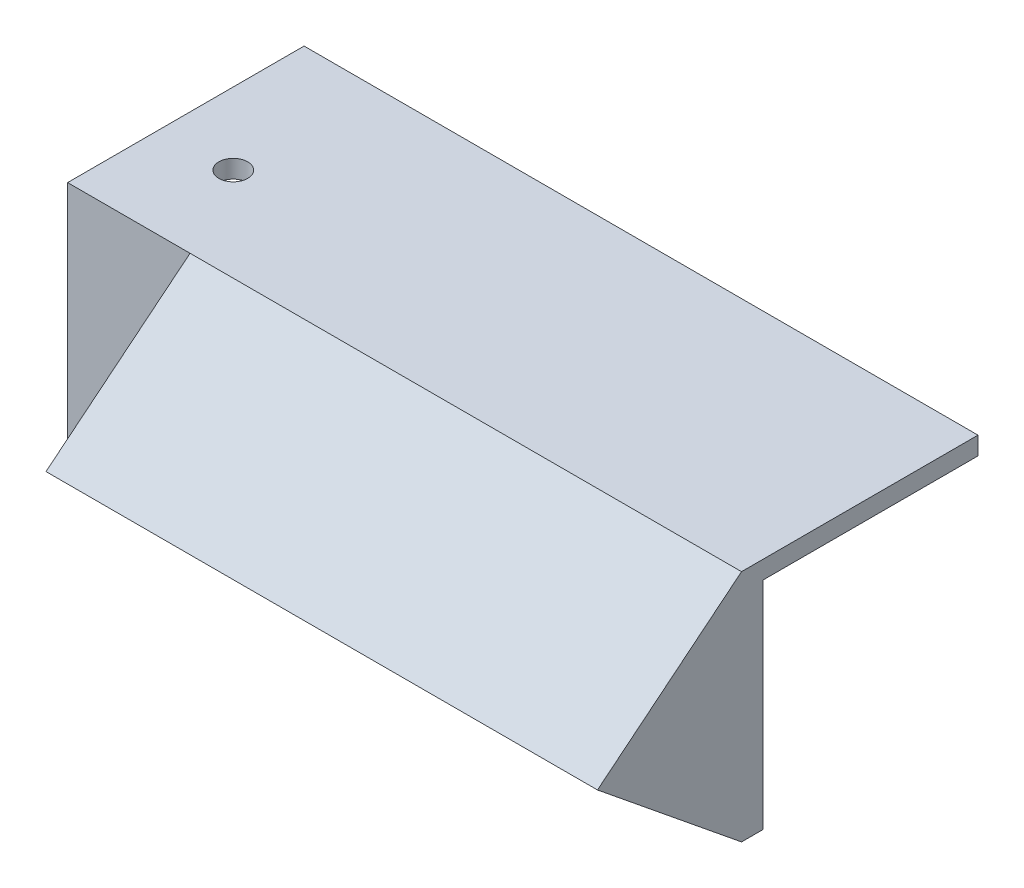
ISO-10303-21;
HEADER;
FILE_DESCRIPTION(('STEP AP214'),'2;1');
FILE_NAME('part.step','',(''),(''),'','','');
FILE_SCHEMA(('AUTOMOTIVE_DESIGN { 1 0 10303 214 1 1 1 1 }'));
ENDSEC;
DATA;
#1=APPLICATION_CONTEXT('core data for automotive mechanical design processes');
#2=APPLICATION_PROTOCOL_DEFINITION('international standard','automotive_design',2000,#1);
#3=PRODUCT_CONTEXT('',#1,'mechanical');
#4=PRODUCT('Part','Part','',(#3));
#5=PRODUCT_RELATED_PRODUCT_CATEGORY('part','',(#4));
#6=PRODUCT_DEFINITION_FORMATION('','',#4);
#7=PRODUCT_DEFINITION_CONTEXT('part definition',#1,'design');
#8=PRODUCT_DEFINITION('design','',#6,#7);
#9=PRODUCT_DEFINITION_SHAPE('','',#8);
#10=(LENGTH_UNIT() NAMED_UNIT(*) SI_UNIT(.MILLI.,.METRE.));
#11=(NAMED_UNIT(*) PLANE_ANGLE_UNIT() SI_UNIT($,.RADIAN.));
#12=(NAMED_UNIT(*) SI_UNIT($,.STERADIAN.) SOLID_ANGLE_UNIT());
#13=UNCERTAINTY_MEASURE_WITH_UNIT(LENGTH_MEASURE(1.E-05),#10,'distance_accuracy_value','');
#14=(GEOMETRIC_REPRESENTATION_CONTEXT(3) GLOBAL_UNCERTAINTY_ASSIGNED_CONTEXT((#13)) GLOBAL_UNIT_ASSIGNED_CONTEXT((#10,
#11,#12)) REPRESENTATION_CONTEXT('',''));
#15=CARTESIAN_POINT('',(0.,0.,0.));
#16=DIRECTION('',(0.,0.,1.));
#17=DIRECTION('',(1.,0.,0.));
#18=AXIS2_PLACEMENT_3D('',#15,#16,#17);
#19=CARTESIAN_POINT('',(0.,0.,91.));
#20=DIRECTION('',(0.,0.,1.));
#21=DIRECTION('',(1.,0.,0.));
#22=AXIS2_PLACEMENT_3D('',#19,#20,#21);
#23=PLANE('',#22);
#24=DIRECTION('',(0.,1.,0.));
#25=VECTOR('',#24,1.);
#26=CARTESIAN_POINT('',(19.,0.,91.));
#27=LINE('',#26,#25);
#28=CARTESIAN_POINT('',(19.,-45.8001,91.));
#29=VERTEX_POINT('',#28);
#30=CARTESIAN_POINT('',(19.,-43.3,91.));
#31=VERTEX_POINT('',#30);
#32=EDGE_CURVE('E155',#29,#31,#27,.T.);
#33=ORIENTED_EDGE('',*,*,#32,.F.);
#34=DIRECTION('',(-1.,0.,0.));
#35=VECTOR('',#34,1.);
#36=CARTESIAN_POINT('',(0.,-45.8001,91.));
#37=LINE('',#36,#35);
#38=CARTESIAN_POINT('',(-74.5662608185419,-45.8001,91.));
#39=VERTEX_POINT('',#38);
#40=EDGE_CURVE('E151',#29,#39,#37,.T.);
#41=ORIENTED_EDGE('',*,*,#40,.T.);
#42=DIRECTION('',(0.,-1.,0.));
#43=VECTOR('',#42,1.);
#44=CARTESIAN_POINT('',(-74.5662608185419,-43.3,91.));
#45=LINE('',#44,#43);
#46=CARTESIAN_POINT('',(-74.5662608185419,-43.3,91.));
#47=VERTEX_POINT('',#46);
#48=EDGE_CURVE('E167',#47,#39,#45,.T.);
#49=ORIENTED_EDGE('',*,*,#48,.F.);
#50=DIRECTION('',(-1.,0.,0.));
#51=VECTOR('',#50,1.);
#52=CARTESIAN_POINT('',(0.,-43.3,91.));
#53=LINE('',#52,#51);
#54=EDGE_CURVE('E39',#31,#47,#53,.T.);
#55=ORIENTED_EDGE('',*,*,#54,.F.);
#56=EDGE_LOOP('',(#33,#41,#49,#55));
#57=FACE_BOUND('',#56,.T.);
#58=ADVANCED_FACE('F35',(#57),#23,.F.);
#59=CARTESIAN_POINT('',(19.,0.,0.));
#60=DIRECTION('',(1.,0.,0.));
#61=DIRECTION('',(0.,0.,-1.));
#62=AXIS2_PLACEMENT_3D('',#59,#60,#61);
#63=PLANE('',#62);
#64=DIRECTION('',(0.,0.,1.));
#65=VECTOR('',#64,1.);
#66=CARTESIAN_POINT('',(19.,-45.8001,0.));
#67=LINE('',#66,#65);
#68=CARTESIAN_POINT('',(19.,-45.8001,120.831364888433));
#69=VERTEX_POINT('',#68);
#70=EDGE_CURVE('E161',#29,#69,#67,.T.);
#71=ORIENTED_EDGE('',*,*,#70,.F.);
#72=ORIENTED_EDGE('',*,*,#32,.T.);
#73=DIRECTION('',(0.,0.,1.));
#74=VECTOR('',#73,1.);
#75=CARTESIAN_POINT('',(19.,-43.3,0.));
#76=LINE('',#75,#74);
#77=CARTESIAN_POINT('',(19.,-43.3,123.831364888433));
#78=VERTEX_POINT('',#77);
#79=EDGE_CURVE('E154',#31,#78,#76,.T.);
#80=ORIENTED_EDGE('',*,*,#79,.T.);
#81=DIRECTION('',(0.,0.630593793828698,-0.776113050518241));
#82=VECTOR('',#81,1.);
#83=CARTESIAN_POINT('',(19.,-59.55005,143.831364888433));
#84=LINE('',#83,#82);
#85=CARTESIAN_POINT('',(19.,-59.55005,143.831364888433));
#86=VERTEX_POINT('',#85);
#87=EDGE_CURVE('E104',#86,#78,#84,.T.);
#88=ORIENTED_EDGE('',*,*,#87,.F.);
#89=DIRECTION('',(0.,-0.630593793828697,-0.776113050518241));
#90=VECTOR('',#89,1.);
#91=CARTESIAN_POINT('',(19.,-106.262866436039,86.3388446364474));
#92=LINE('',#91,#90);
#93=CARTESIAN_POINT('',(19.,-75.8001,123.831364888433));
#94=VERTEX_POINT('',#93);
#95=EDGE_CURVE('E11',#86,#94,#92,.T.);
#96=ORIENTED_EDGE('',*,*,#95,.T.);
#97=DIRECTION('',(0.,0.,1.));
#98=VECTOR('',#97,1.);
#99=CARTESIAN_POINT('',(19.,-75.8001,123.831364888433));
#100=LINE('',#99,#98);
#101=CARTESIAN_POINT('',(19.,-75.8001,120.831364888433));
#102=VERTEX_POINT('',#101);
#103=EDGE_CURVE('E159',#102,#94,#100,.T.);
#104=ORIENTED_EDGE('',*,*,#103,.F.);
#105=DIRECTION('',(0.,1.,0.));
#106=VECTOR('',#105,1.);
#107=CARTESIAN_POINT('',(19.,0.,120.831364888433));
#108=LINE('',#107,#106);
#109=EDGE_CURVE('E44',#102,#69,#108,.T.);
#110=ORIENTED_EDGE('',*,*,#109,.T.);
#111=EDGE_LOOP('',(#71,#72,#80,#88,#96,#104,#110));
#112=FACE_BOUND('',#111,.T.);
#113=ADVANCED_FACE('F37',(#112),#63,.T.);
#114=CARTESIAN_POINT('',(0.,-43.3,0.));
#115=DIRECTION('',(0.,-1.,0.));
#116=DIRECTION('',(0.,0.,-1.));
#117=AXIS2_PLACEMENT_3D('',#114,#115,#116);
#118=PLANE('',#117);
#119=CARTESIAN_POINT('',(-64.5662608185419,-43.3,110.831364888433));
#120=DIRECTION('',(0.,-1.,0.));
#121=DIRECTION('',(0.,0.,-1.));
#122=AXIS2_PLACEMENT_3D('',#119,#120,#121);
#123=CIRCLE('',#122,2.);
#124=CARTESIAN_POINT('',(-64.5662608185419,-43.3,108.831364888433));
#125=VERTEX_POINT('',#124);
#126=EDGE_CURVE('E105',#125,#125,#123,.T.);
#127=ORIENTED_EDGE('',*,*,#126,.T.);
#128=EDGE_LOOP('',(#127));
#129=FACE_BOUND('',#128,.T.);
#130=ORIENTED_EDGE('',*,*,#79,.F.);
#131=ORIENTED_EDGE('',*,*,#54,.T.);
#132=DIRECTION('',(0.,0.,1.));
#133=VECTOR('',#132,1.);
#134=CARTESIAN_POINT('',(-74.5662608185419,-43.3,0.));
#135=LINE('',#134,#133);
#136=CARTESIAN_POINT('',(-74.5662608185419,-43.3,123.831364888433));
#137=VERTEX_POINT('',#136);
#138=EDGE_CURVE('E147',#47,#137,#135,.T.);
#139=ORIENTED_EDGE('',*,*,#138,.T.);
#140=DIRECTION('',(-1.,0.,0.));
#141=VECTOR('',#140,1.);
#142=CARTESIAN_POINT('',(0.,-43.3,123.831364888433));
#143=LINE('',#142,#141);
#144=CARTESIAN_POINT('',(-57.5662608185419,-43.3,123.831364888433));
#145=VERTEX_POINT('',#144);
#146=EDGE_CURVE('E126',#145,#137,#143,.T.);
#147=ORIENTED_EDGE('',*,*,#146,.F.);
#148=DIRECTION('',(-1.,0.,0.));
#149=VECTOR('',#148,1.);
#150=CARTESIAN_POINT('',(114.023739181458,-43.3,123.831364888433));
#151=LINE('',#150,#149);
#152=EDGE_CURVE('E117',#78,#145,#151,.T.);
#153=ORIENTED_EDGE('',*,*,#152,.F.);
#154=EDGE_LOOP('',(#130,#131,#139,#147,#153));
#155=FACE_BOUND('',#154,.T.);
#156=ADVANCED_FACE('F173',(#129,#155),#118,.F.);
#157=CARTESIAN_POINT('',(0.,-45.8001,0.));
#158=DIRECTION('',(0.,-1.,0.));
#159=DIRECTION('',(0.,0.,-1.));
#160=AXIS2_PLACEMENT_3D('',#157,#158,#159);
#161=PLANE('',#160);
#162=CARTESIAN_POINT('',(-64.5662608185419,-45.8001,110.831364888433));
#163=DIRECTION('',(0.,-1.,0.));
#164=DIRECTION('',(0.,0.,-1.));
#165=AXIS2_PLACEMENT_3D('',#162,#163,#164);
#166=CIRCLE('',#165,2.);
#167=CARTESIAN_POINT('',(-64.5662608185419,-45.8001,108.831364888433));
#168=VERTEX_POINT('',#167);
#169=EDGE_CURVE('E144',#168,#168,#166,.T.);
#170=ORIENTED_EDGE('',*,*,#169,.F.);
#171=EDGE_LOOP('',(#170));
#172=FACE_BOUND('',#171,.T.);
#173=ORIENTED_EDGE('',*,*,#40,.F.);
#174=ORIENTED_EDGE('',*,*,#70,.T.);
#175=DIRECTION('',(-1.,0.,0.));
#176=VECTOR('',#175,1.);
#177=CARTESIAN_POINT('',(0.,-45.8001,120.831364888433));
#178=LINE('',#177,#176);
#179=CARTESIAN_POINT('',(-74.5662608185419,-45.8001,120.831364888433));
#180=VERTEX_POINT('',#179);
#181=EDGE_CURVE('E139',#69,#180,#178,.T.);
#182=ORIENTED_EDGE('',*,*,#181,.T.);
#183=DIRECTION('',(0.,0.,1.));
#184=VECTOR('',#183,1.);
#185=CARTESIAN_POINT('',(-74.5662608185419,-45.8001,0.));
#186=LINE('',#185,#184);
#187=EDGE_CURVE('E142',#39,#180,#186,.T.);
#188=ORIENTED_EDGE('',*,*,#187,.F.);
#189=EDGE_LOOP('',(#173,#174,#182,#188));
#190=FACE_BOUND('',#189,.T.);
#191=ADVANCED_FACE('F190',(#172,#190),#161,.T.);
#192=CARTESIAN_POINT('',(0.,-75.8001,123.831364888433));
#193=DIRECTION('',(0.,-1.,0.));
#194=DIRECTION('',(0.,0.,-1.));
#195=AXIS2_PLACEMENT_3D('',#192,#193,#194);
#196=PLANE('',#195);
#197=DIRECTION('',(-1.,0.,0.));
#198=VECTOR('',#197,1.);
#199=CARTESIAN_POINT('',(0.,-75.8001,120.831364888433));
#200=LINE('',#199,#198);
#201=CARTESIAN_POINT('',(-74.5662608185419,-75.8001,120.831364888433));
#202=VERTEX_POINT('',#201);
#203=EDGE_CURVE('E123',#102,#202,#200,.T.);
#204=ORIENTED_EDGE('',*,*,#203,.F.);
#205=ORIENTED_EDGE('',*,*,#103,.T.);
#206=DIRECTION('',(-1.,0.,0.));
#207=VECTOR('',#206,1.);
#208=CARTESIAN_POINT('',(114.023739181458,-75.8001,123.831364888433));
#209=LINE('',#208,#207);
#210=CARTESIAN_POINT('',(-57.5662608185419,-75.8001,123.831364888433));
#211=VERTEX_POINT('',#210);
#212=EDGE_CURVE('E60',#94,#211,#209,.T.);
#213=ORIENTED_EDGE('',*,*,#212,.T.);
#214=DIRECTION('',(-1.,0.,0.));
#215=VECTOR('',#214,1.);
#216=CARTESIAN_POINT('',(0.,-75.8001,123.831364888433));
#217=LINE('',#216,#215);
#218=CARTESIAN_POINT('',(-74.5662608185419,-75.8001,123.831364888433));
#219=VERTEX_POINT('',#218);
#220=EDGE_CURVE('E124',#211,#219,#217,.T.);
#221=ORIENTED_EDGE('',*,*,#220,.T.);
#222=DIRECTION('',(0.,0.,-1.));
#223=VECTOR('',#222,1.);
#224=CARTESIAN_POINT('',(-74.5662608185419,-75.8001,123.831364888433));
#225=LINE('',#224,#223);
#226=EDGE_CURVE('E133',#219,#202,#225,.T.);
#227=ORIENTED_EDGE('',*,*,#226,.T.);
#228=EDGE_LOOP('',(#204,#205,#213,#221,#227));
#229=FACE_BOUND('',#228,.T.);
#230=ADVANCED_FACE('F184',(#229),#196,.T.);
#231=CARTESIAN_POINT('',(0.,0.,120.831364888433));
#232=DIRECTION('',(0.,0.,1.));
#233=DIRECTION('',(1.,0.,0.));
#234=AXIS2_PLACEMENT_3D('',#231,#232,#233);
#235=PLANE('',#234);
#236=ORIENTED_EDGE('',*,*,#109,.F.);
#237=ORIENTED_EDGE('',*,*,#203,.T.);
#238=DIRECTION('',(0.,-1.,0.));
#239=VECTOR('',#238,1.);
#240=CARTESIAN_POINT('',(-74.5662608185419,0.,120.831364888433));
#241=LINE('',#240,#239);
#242=EDGE_CURVE('E127',#180,#202,#241,.T.);
#243=ORIENTED_EDGE('',*,*,#242,.F.);
#244=ORIENTED_EDGE('',*,*,#181,.F.);
#245=EDGE_LOOP('',(#236,#237,#243,#244));
#246=FACE_BOUND('',#245,.T.);
#247=ADVANCED_FACE('F193',(#246),#235,.F.);
#248=CARTESIAN_POINT('',(114.023739181458,-59.55005,143.831364888433));
#249=DIRECTION('',(0.,0.776113050518241,0.630593793828698));
#250=DIRECTION('',(0.,-0.630593793828698,0.776113050518241));
#251=AXIS2_PLACEMENT_3D('',#248,#249,#250);
#252=PLANE('',#251);
#253=DIRECTION('',(-1.,0.,0.));
#254=VECTOR('',#253,1.);
#255=CARTESIAN_POINT('',(0.,-59.55005,143.831364888433));
#256=LINE('',#255,#254);
#257=CARTESIAN_POINT('',(-57.5662608185419,-59.55005,143.831364888433));
#258=VERTEX_POINT('',#257);
#259=EDGE_CURVE('E52',#86,#258,#256,.T.);
#260=ORIENTED_EDGE('',*,*,#259,.F.);
#261=ORIENTED_EDGE('',*,*,#87,.T.);
#262=ORIENTED_EDGE('',*,*,#152,.T.);
#263=DIRECTION('',(0.,0.630593793828698,-0.776113050518241));
#264=VECTOR('',#263,1.);
#265=CARTESIAN_POINT('',(-57.5662608185419,-59.55005,143.831364888433));
#266=LINE('',#265,#264);
#267=EDGE_CURVE('E111',#258,#145,#266,.T.);
#268=ORIENTED_EDGE('',*,*,#267,.F.);
#269=EDGE_LOOP('',(#260,#261,#262,#268));
#270=FACE_BOUND('',#269,.T.);
#271=ADVANCED_FACE('F115',(#270),#252,.T.);
#272=CARTESIAN_POINT('',(114.023739181458,-106.262866436039,86.3388446364474));
#273=DIRECTION('',(0.,0.776113050518241,-0.630593793828697));
#274=DIRECTION('',(0.,0.630593793828697,0.776113050518241));
#275=AXIS2_PLACEMENT_3D('',#272,#273,#274);
#276=PLANE('',#275);
#277=ORIENTED_EDGE('',*,*,#95,.F.);
#278=ORIENTED_EDGE('',*,*,#259,.T.);
#279=DIRECTION('',(0.,-0.630593793828697,-0.776113050518241));
#280=VECTOR('',#279,1.);
#281=CARTESIAN_POINT('',(-57.5662608185419,-106.262866436039,86.3388446364474));
#282=LINE('',#281,#280);
#283=EDGE_CURVE('E102',#258,#211,#282,.T.);
#284=ORIENTED_EDGE('',*,*,#283,.T.);
#285=ORIENTED_EDGE('',*,*,#212,.F.);
#286=EDGE_LOOP('',(#277,#278,#284,#285));
#287=FACE_BOUND('',#286,.T.);
#288=ADVANCED_FACE('F101',(#287),#276,.F.);
#289=CARTESIAN_POINT('',(-57.5662608185419,-48.3,143.831364888433));
#290=DIRECTION('',(1.,0.,0.));
#291=DIRECTION('',(0.,0.,-1.));
#292=AXIS2_PLACEMENT_3D('',#289,#290,#291);
#293=PLANE('',#292);
#294=DIRECTION('',(0.,-1.,0.));
#295=VECTOR('',#294,1.);
#296=CARTESIAN_POINT('',(-57.5662608185419,-48.3,123.831364888433));
#297=LINE('',#296,#295);
#298=EDGE_CURVE('E113',#145,#211,#297,.T.);
#299=ORIENTED_EDGE('',*,*,#298,.T.);
#300=ORIENTED_EDGE('',*,*,#283,.F.);
#301=ORIENTED_EDGE('',*,*,#267,.T.);
#302=EDGE_LOOP('',(#299,#300,#301));
#303=FACE_BOUND('',#302,.T.);
#304=ADVANCED_FACE('F110',(#303),#293,.F.);
#305=CARTESIAN_POINT('',(-74.5662608185419,-43.3,0.));
#306=DIRECTION('',(1.,0.,0.));
#307=DIRECTION('',(0.,0.,-1.));
#308=AXIS2_PLACEMENT_3D('',#305,#306,#307);
#309=PLANE('',#308);
#310=ORIENTED_EDGE('',*,*,#138,.F.);
#311=ORIENTED_EDGE('',*,*,#48,.T.);
#312=ORIENTED_EDGE('',*,*,#187,.T.);
#313=ORIENTED_EDGE('',*,*,#242,.T.);
#314=ORIENTED_EDGE('',*,*,#226,.F.);
#315=DIRECTION('',(0.,-1.,0.));
#316=VECTOR('',#315,1.);
#317=CARTESIAN_POINT('',(-74.5662608185419,0.,123.831364888433));
#318=LINE('',#317,#316);
#319=EDGE_CURVE('E130',#137,#219,#318,.T.);
#320=ORIENTED_EDGE('',*,*,#319,.F.);
#321=EDGE_LOOP('',(#310,#311,#312,#313,#314,#320));
#322=FACE_BOUND('',#321,.T.);
#323=ADVANCED_FACE('F179',(#322),#309,.F.);
#324=CARTESIAN_POINT('',(-64.5662608185419,-43.3,110.831364888433));
#325=DIRECTION('',(0.,-1.,0.));
#326=DIRECTION('',(0.,0.,-1.));
#327=AXIS2_PLACEMENT_3D('',#324,#325,#326);
#328=CYLINDRICAL_SURFACE('',#327,2.);
#329=ORIENTED_EDGE('',*,*,#126,.F.);
#330=EDGE_LOOP('',(#329));
#331=FACE_BOUND('',#330,.T.);
#332=ORIENTED_EDGE('',*,*,#169,.T.);
#333=EDGE_LOOP('',(#332));
#334=FACE_BOUND('',#333,.T.);
#335=ADVANCED_FACE('F211',(#331,#334),#328,.F.);
#336=CARTESIAN_POINT('',(0.,0.,123.831364888433));
#337=DIRECTION('',(0.,0.,1.));
#338=DIRECTION('',(1.,0.,0.));
#339=AXIS2_PLACEMENT_3D('',#336,#337,#338);
#340=PLANE('',#339);
#341=ORIENTED_EDGE('',*,*,#298,.F.);
#342=ORIENTED_EDGE('',*,*,#146,.T.);
#343=ORIENTED_EDGE('',*,*,#319,.T.);
#344=ORIENTED_EDGE('',*,*,#220,.F.);
#345=EDGE_LOOP('',(#341,#342,#343,#344));
#346=FACE_BOUND('',#345,.T.);
#347=ADVANCED_FACE('F182',(#346),#340,.T.);
#348=CLOSED_SHELL('',(#58,#113,#156,#191,#230,#247,#271,#288,#304,#323,#335,#347));
#349=MANIFOLD_SOLID_BREP('B2',#348);
#350=ADVANCED_BREP_SHAPE_REPRESENTATION('',(#18,#349),#14);
#351=SHAPE_DEFINITION_REPRESENTATION(#9,#350);
ENDSEC;
END-ISO-10303-21;
